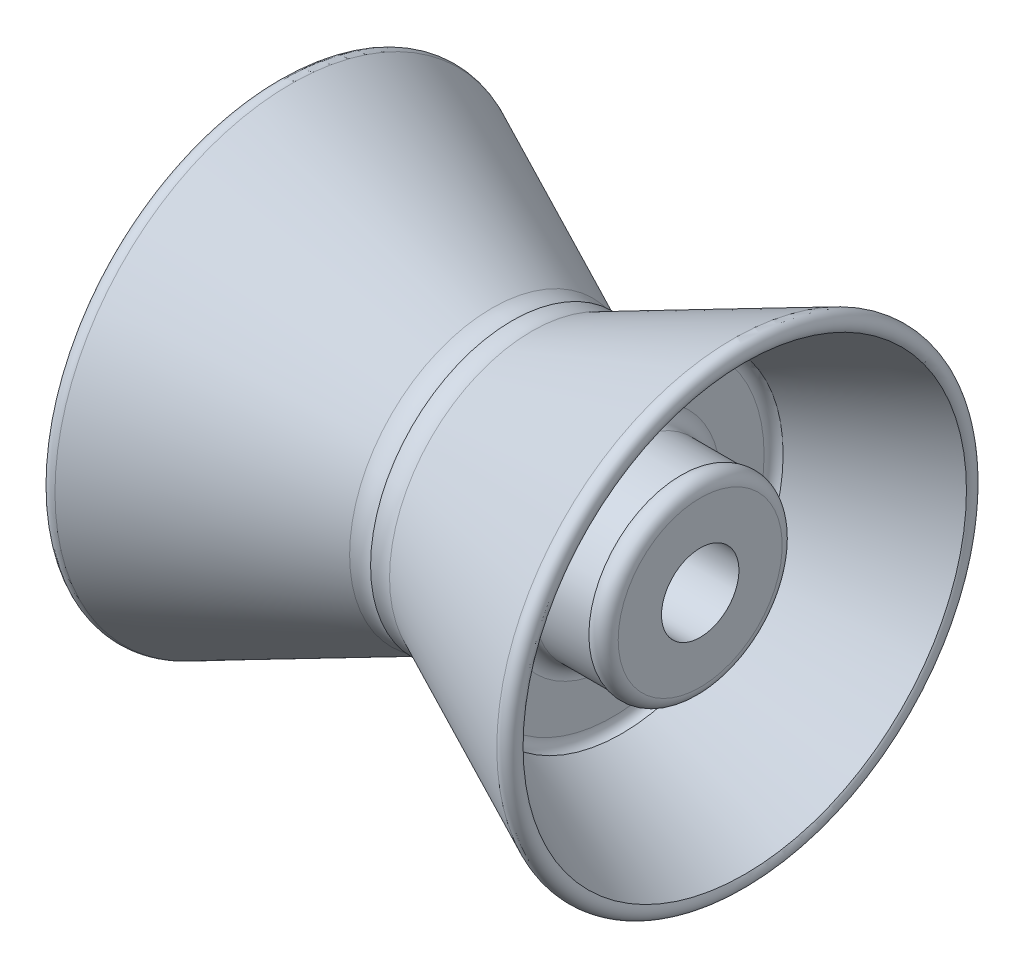
ISO-10303-21;
HEADER;
FILE_DESCRIPTION(('STEP AP214'),'2;1');
FILE_NAME('part.step','',(''),(''),'','','');
FILE_SCHEMA(('AUTOMOTIVE_DESIGN { 1 0 10303 214 1 1 1 1 }'));
ENDSEC;
DATA;
#1=APPLICATION_CONTEXT('core data for automotive mechanical design processes');
#2=APPLICATION_PROTOCOL_DEFINITION('international standard','automotive_design',2000,#1);
#3=PRODUCT_CONTEXT('',#1,'mechanical');
#4=PRODUCT('Part','Part','',(#3));
#5=PRODUCT_RELATED_PRODUCT_CATEGORY('part','',(#4));
#6=PRODUCT_DEFINITION_FORMATION('','',#4);
#7=PRODUCT_DEFINITION_CONTEXT('part definition',#1,'design');
#8=PRODUCT_DEFINITION('design','',#6,#7);
#9=PRODUCT_DEFINITION_SHAPE('','',#8);
#10=(LENGTH_UNIT() NAMED_UNIT(*) SI_UNIT(.MILLI.,.METRE.));
#11=(NAMED_UNIT(*) PLANE_ANGLE_UNIT() SI_UNIT($,.RADIAN.));
#12=(NAMED_UNIT(*) SI_UNIT($,.STERADIAN.) SOLID_ANGLE_UNIT());
#13=UNCERTAINTY_MEASURE_WITH_UNIT(LENGTH_MEASURE(1.E-05),#10,'distance_accuracy_value','');
#14=(GEOMETRIC_REPRESENTATION_CONTEXT(3) GLOBAL_UNCERTAINTY_ASSIGNED_CONTEXT((#13)) GLOBAL_UNIT_ASSIGNED_CONTEXT((#10,
#11,#12)) REPRESENTATION_CONTEXT('',''));
#15=CARTESIAN_POINT('',(0.,0.,0.));
#16=DIRECTION('',(0.,0.,1.));
#17=DIRECTION('',(1.,0.,0.));
#18=AXIS2_PLACEMENT_3D('',#15,#16,#17);
#19=CARTESIAN_POINT('',(89.9457941325228,0.,0.));
#20=DIRECTION('',(-1.,0.,0.));
#21=DIRECTION('',(0.,0.,1.));
#22=AXIS2_PLACEMENT_3D('',#19,#20,#21);
#23=PLANE('',#22);
#24=CARTESIAN_POINT('',(89.9457941325228,0.,0.));
#25=DIRECTION('',(-1.,0.,0.));
#26=DIRECTION('',(0.,0.,1.));
#27=AXIS2_PLACEMENT_3D('',#24,#25,#26);
#28=CIRCLE('',#27,39.1901164459736);
#29=CARTESIAN_POINT('',(89.9457941325228,0.,39.1901164459736));
#30=VERTEX_POINT('',#29);
#31=EDGE_CURVE('E10',#30,#30,#28,.T.);
#32=ORIENTED_EDGE('',*,*,#31,.F.);
#33=EDGE_LOOP('',(#32));
#34=FACE_BOUND('',#33,.T.);
#35=CARTESIAN_POINT('',(89.9457941325228,0.,0.));
#36=DIRECTION('',(-1.,0.,0.));
#37=DIRECTION('',(0.,0.,1.));
#38=AXIS2_PLACEMENT_3D('',#35,#36,#37);
#39=CIRCLE('',#38,18.495820800439);
#40=CARTESIAN_POINT('',(89.9457941325228,0.,18.495820800439));
#41=VERTEX_POINT('',#40);
#42=EDGE_CURVE('E164',#41,#41,#39,.T.);
#43=ORIENTED_EDGE('',*,*,#42,.T.);
#44=EDGE_LOOP('',(#43));
#45=FACE_BOUND('',#44,.T.);
#46=ADVANCED_FACE('F41',(#34,#45),#23,.F.);
#47=CARTESIAN_POINT('',(84.0599196998988,0.,0.));
#48=DIRECTION('',(-1.,0.,0.));
#49=DIRECTION('',(0.,0.,1.));
#50=AXIS2_PLACEMENT_3D('',#47,#48,#49);
#51=TOROIDAL_SURFACE('',#50,39.1901164459736,5.88587443262402);
#52=CARTESIAN_POINT('',(80.8781849582641,0.,0.));
#53=DIRECTION('',(-1.,0.,0.));
#54=DIRECTION('',(0.,0.,1.));
#55=AXIS2_PLACEMENT_3D('',#52,#53,#54);
#56=CIRCLE('',#55,44.1418920740178);
#57=CARTESIAN_POINT('',(80.8781849582641,0.,44.1418920740178));
#58=VERTEX_POINT('',#57);
#59=EDGE_CURVE('E48',#58,#58,#56,.T.);
#60=ORIENTED_EDGE('',*,*,#59,.F.);
#61=EDGE_LOOP('',(#60));
#62=FACE_BOUND('',#61,.T.);
#63=ORIENTED_EDGE('',*,*,#31,.T.);
#64=EDGE_LOOP('',(#63));
#65=FACE_BOUND('',#64,.T.);
#66=ADVANCED_FACE('F188',(#62,#65),#51,.T.);
#67=CARTESIAN_POINT('',(-137.85754493321,0.,0.));
#68=DIRECTION('',(-1.,0.,0.));
#69=DIRECTION('',(0.,0.,1.));
#70=AXIS2_PLACEMENT_3D('',#67,#68,#69);
#71=CYLINDRICAL_SURFACE('',#70,44.1418920740178);
#72=CARTESIAN_POINT('',(54.4687149420286,0.,0.));
#73=DIRECTION('',(-1.,0.,0.));
#74=DIRECTION('',(0.,0.,1.));
#75=AXIS2_PLACEMENT_3D('',#72,#73,#74);
#76=CIRCLE('',#75,44.1418920740178);
#77=CARTESIAN_POINT('',(54.4687149420286,0.,44.1418920740178));
#78=VERTEX_POINT('',#77);
#79=EDGE_CURVE('E53',#78,#78,#76,.T.);
#80=ORIENTED_EDGE('',*,*,#79,.F.);
#81=EDGE_LOOP('',(#80));
#82=FACE_BOUND('',#81,.T.);
#83=ORIENTED_EDGE('',*,*,#59,.T.);
#84=EDGE_LOOP('',(#83));
#85=FACE_BOUND('',#84,.T.);
#86=ADVANCED_FACE('F193',(#82,#85),#71,.T.);
#87=CARTESIAN_POINT('',(54.4687149420286,0.,0.));
#88=DIRECTION('',(-1.,0.,0.));
#89=DIRECTION('',(0.,0.,1.));
#90=AXIS2_PLACEMENT_3D('',#87,#88,#89);
#91=TOROIDAL_SURFACE('',#90,50.6095758659713,6.4676837919535);
#92=CARTESIAN_POINT('',(48.0726714224715,0.,0.));
#93=DIRECTION('',(-1.,0.,0.));
#94=DIRECTION('',(0.,0.,1.));
#95=AXIS2_PLACEMENT_3D('',#92,#93,#94);
#96=CIRCLE('',#95,51.569555516084);
#97=CARTESIAN_POINT('',(48.0726714224715,0.,51.569555516084));
#98=VERTEX_POINT('',#97);
#99=EDGE_CURVE('E58',#98,#98,#96,.T.);
#100=ORIENTED_EDGE('',*,*,#99,.F.);
#101=EDGE_LOOP('',(#100));
#102=FACE_BOUND('',#101,.T.);
#103=ORIENTED_EDGE('',*,*,#79,.T.);
#104=EDGE_LOOP('',(#103));
#105=FACE_BOUND('',#104,.T.);
#106=ADVANCED_FACE('F198',(#102,#105),#91,.F.);
#107=CARTESIAN_POINT('',(48.0726714224715,0.,0.));
#108=DIRECTION('',(-1.,0.,0.));
#109=DIRECTION('',(0.,0.,1.));
#110=AXIS2_PLACEMENT_3D('',#107,#108,#109);
#111=PLANE('',#110);
#112=CARTESIAN_POINT('',(48.0726714224715,0.,0.));
#113=DIRECTION('',(-1.,0.,0.));
#114=DIRECTION('',(0.,0.,1.));
#115=AXIS2_PLACEMENT_3D('',#112,#113,#114);
#116=CIRCLE('',#115,72.40827795077);
#117=CARTESIAN_POINT('',(48.0726714224715,0.,72.40827795077));
#118=VERTEX_POINT('',#117);
#119=EDGE_CURVE('E64',#118,#118,#116,.T.);
#120=ORIENTED_EDGE('',*,*,#119,.F.);
#121=EDGE_LOOP('',(#120));
#122=FACE_BOUND('',#121,.T.);
#123=ORIENTED_EDGE('',*,*,#99,.T.);
#124=EDGE_LOOP('',(#123));
#125=FACE_BOUND('',#124,.T.);
#126=ADVANCED_FACE('F204',(#122,#125),#111,.F.);
#127=CARTESIAN_POINT('',(52.8391522413573,0.,0.));
#128=DIRECTION('',(-1.,0.,0.));
#129=DIRECTION('',(0.,0.,1.));
#130=AXIS2_PLACEMENT_3D('',#127,#128,#129);
#131=TOROIDAL_SURFACE('',#130,72.40827795077,4.76648081888577);
#132=CARTESIAN_POINT('',(52.424586516698,0.,0.));
#133=DIRECTION('',(-1.,0.,0.));
#134=DIRECTION('',(0.,0.,1.));
#135=AXIS2_PLACEMENT_3D('',#132,#133,#134);
#136=CIRCLE('',#135,77.1566960722862);
#137=CARTESIAN_POINT('',(52.424586516698,0.,77.1566960722862));
#138=VERTEX_POINT('',#137);
#139=EDGE_CURVE('E68',#138,#138,#136,.T.);
#140=ORIENTED_EDGE('',*,*,#139,.F.);
#141=EDGE_LOOP('',(#140));
#142=FACE_BOUND('',#141,.T.);
#143=ORIENTED_EDGE('',*,*,#119,.T.);
#144=EDGE_LOOP('',(#143));
#145=FACE_BOUND('',#144,.T.);
#146=ADVANCED_FACE('F208',(#142,#145),#131,.F.);
#147=CARTESIAN_POINT('',(52.424586516698,0.,0.));
#148=DIRECTION('',(1.,0.,0.));
#149=DIRECTION('',(0.,0.,-1.));
#150=AXIS2_PLACEMENT_3D('',#147,#148,#149);
#151=CONICAL_SURFACE('',#150,77.1566960722862,0.455219161986922);
#152=CARTESIAN_POINT('',(111.246164538201,0.,0.));
#153=DIRECTION('',(-1.,0.,0.));
#154=DIRECTION('',(0.,0.,1.));
#155=AXIS2_PLACEMENT_3D('',#152,#153,#154);
#156=CIRCLE('',#155,105.95035301);
#157=CARTESIAN_POINT('',(111.246164538201,0.,105.95035301));
#158=VERTEX_POINT('',#157);
#159=EDGE_CURVE('E72',#158,#158,#156,.T.);
#160=ORIENTED_EDGE('',*,*,#159,.F.);
#161=EDGE_LOOP('',(#160));
#162=FACE_BOUND('',#161,.T.);
#163=ORIENTED_EDGE('',*,*,#139,.T.);
#164=EDGE_LOOP('',(#163));
#165=FACE_BOUND('',#164,.T.);
#166=ADVANCED_FACE('F212',(#162,#165),#151,.F.);
#167=CARTESIAN_POINT('',(107.525373797043,0.,0.));
#168=DIRECTION('',(-1.,0.,0.));
#169=DIRECTION('',(0.,0.,1.));
#170=AXIS2_PLACEMENT_3D('',#167,#168,#169);
#171=TOROIDAL_SURFACE('',#170,108.669777380016,4.60863891444369);
#172=ORIENTED_EDGE('',*,*,#159,.T.);
#173=EDGE_LOOP('',(#172));
#174=FACE_BOUND('',#173,.T.);
#175=CARTESIAN_POINT('',(105.57767883003,0.,0.));
#176=DIRECTION('',(-1.,0.,0.));
#177=DIRECTION('',(0.,0.,1.));
#178=AXIS2_PLACEMENT_3D('',#175,#176,#177);
#179=CIRCLE('',#178,112.846622715816);
#180=CARTESIAN_POINT('',(105.57767883003,0.,112.846622715816));
#181=VERTEX_POINT('',#180);
#182=EDGE_CURVE('E76',#181,#181,#179,.T.);
#183=ORIENTED_EDGE('',*,*,#182,.F.);
#184=EDGE_LOOP('',(#183));
#185=FACE_BOUND('',#184,.T.);
#186=ADVANCED_FACE('F216',(#174,#185),#171,.T.);
#187=CARTESIAN_POINT('',(105.57767883003,0.,0.));
#188=DIRECTION('',(1.,0.,0.));
#189=DIRECTION('',(0.,0.,-1.));
#190=AXIS2_PLACEMENT_3D('',#187,#188,#189);
#191=CONICAL_SURFACE('',#190,112.846622715816,0.43633231299858);
#192=CARTESIAN_POINT('',(9.54236568612607,0.,0.));
#193=DIRECTION('',(-1.,0.,0.));
#194=DIRECTION('',(0.,0.,1.));
#195=AXIS2_PLACEMENT_3D('',#192,#193,#194);
#196=CIRCLE('',#195,68.0646207435005);
#197=CARTESIAN_POINT('',(9.54236568612607,0.,68.0646207435005));
#198=VERTEX_POINT('',#197);
#199=EDGE_CURVE('E80',#198,#198,#196,.T.);
#200=ORIENTED_EDGE('',*,*,#199,.F.);
#201=EDGE_LOOP('',(#200));
#202=FACE_BOUND('',#201,.T.);
#203=ORIENTED_EDGE('',*,*,#182,.T.);
#204=EDGE_LOOP('',(#203));
#205=FACE_BOUND('',#204,.T.);
#206=ADVANCED_FACE('F220',(#202,#205),#191,.T.);
#207=CARTESIAN_POINT('',(4.18430612992772,0.,0.));
#208=DIRECTION('',(-1.,0.,0.));
#209=DIRECTION('',(0.,0.,1.));
#210=AXIS2_PLACEMENT_3D('',#207,#208,#209);
#211=TOROIDAL_SURFACE('',#210,79.5550165422703,12.678249004502);
#212=CARTESIAN_POINT('',(0.,0.,0.));
#213=DIRECTION('',(-1.,0.,0.));
#214=DIRECTION('',(0.,0.,1.));
#215=AXIS2_PLACEMENT_3D('',#212,#213,#214);
#216=CIRCLE('',#215,67.5871604255213);
#217=CARTESIAN_POINT('',(0.,0.,67.5871604255213));
#218=VERTEX_POINT('',#217);
#219=EDGE_CURVE('E84',#218,#218,#216,.T.);
#220=ORIENTED_EDGE('',*,*,#219,.F.);
#221=EDGE_LOOP('',(#220));
#222=FACE_BOUND('',#221,.T.);
#223=ORIENTED_EDGE('',*,*,#199,.T.);
#224=EDGE_LOOP('',(#223));
#225=FACE_BOUND('',#224,.T.);
#226=ADVANCED_FACE('F224',(#222,#225),#211,.F.);
#227=CARTESIAN_POINT('',(-4.18430612992771,0.,0.));
#228=DIRECTION('',(-1.,0.,0.));
#229=DIRECTION('',(0.,0.,1.));
#230=AXIS2_PLACEMENT_3D('',#227,#228,#229);
#231=TOROIDAL_SURFACE('',#230,79.5550165422703,12.678249004502);
#232=ORIENTED_EDGE('',*,*,#219,.T.);
#233=EDGE_LOOP('',(#232));
#234=FACE_BOUND('',#233,.T.);
#235=CARTESIAN_POINT('',(-9.54236568612607,0.,0.));
#236=DIRECTION('',(-1.,0.,0.));
#237=DIRECTION('',(0.,0.,1.));
#238=AXIS2_PLACEMENT_3D('',#235,#236,#237);
#239=CIRCLE('',#238,68.0646207435005);
#240=CARTESIAN_POINT('',(-9.54236568612607,0.,68.0646207435005));
#241=VERTEX_POINT('',#240);
#242=EDGE_CURVE('E88',#241,#241,#239,.T.);
#243=ORIENTED_EDGE('',*,*,#242,.F.);
#244=EDGE_LOOP('',(#243));
#245=FACE_BOUND('',#244,.T.);
#246=ADVANCED_FACE('F228',(#234,#245),#231,.F.);
#247=CARTESIAN_POINT('',(-105.57767883003,0.,0.));
#248=DIRECTION('',(-1.,0.,0.));
#249=DIRECTION('',(0.,0.,1.));
#250=AXIS2_PLACEMENT_3D('',#247,#248,#249);
#251=CONICAL_SURFACE('',#250,112.846622715816,0.43633231299858);
#252=ORIENTED_EDGE('',*,*,#242,.T.);
#253=EDGE_LOOP('',(#252));
#254=FACE_BOUND('',#253,.T.);
#255=CARTESIAN_POINT('',(-105.57767883003,0.,0.));
#256=DIRECTION('',(-1.,0.,0.));
#257=DIRECTION('',(0.,0.,1.));
#258=AXIS2_PLACEMENT_3D('',#255,#256,#257);
#259=CIRCLE('',#258,112.846622715816);
#260=CARTESIAN_POINT('',(-105.57767883003,0.,112.846622715816));
#261=VERTEX_POINT('',#260);
#262=EDGE_CURVE('E92',#261,#261,#259,.T.);
#263=ORIENTED_EDGE('',*,*,#262,.F.);
#264=EDGE_LOOP('',(#263));
#265=FACE_BOUND('',#264,.T.);
#266=ADVANCED_FACE('F232',(#254,#265),#251,.T.);
#267=CARTESIAN_POINT('',(-107.525373797043,0.,0.));
#268=DIRECTION('',(-1.,0.,0.));
#269=DIRECTION('',(0.,0.,1.));
#270=AXIS2_PLACEMENT_3D('',#267,#268,#269);
#271=TOROIDAL_SURFACE('',#270,108.669777380016,4.60863891444369);
#272=CARTESIAN_POINT('',(-111.246164538201,0.,0.));
#273=DIRECTION('',(-1.,0.,0.));
#274=DIRECTION('',(0.,0.,1.));
#275=AXIS2_PLACEMENT_3D('',#272,#273,#274);
#276=CIRCLE('',#275,105.950353009999);
#277=CARTESIAN_POINT('',(-111.246164538201,0.,105.950353009999));
#278=VERTEX_POINT('',#277);
#279=EDGE_CURVE('E96',#278,#278,#276,.T.);
#280=ORIENTED_EDGE('',*,*,#279,.F.);
#281=EDGE_LOOP('',(#280));
#282=FACE_BOUND('',#281,.T.);
#283=ORIENTED_EDGE('',*,*,#262,.T.);
#284=EDGE_LOOP('',(#283));
#285=FACE_BOUND('',#284,.T.);
#286=ADVANCED_FACE('F236',(#282,#285),#271,.T.);
#287=CARTESIAN_POINT('',(-52.424586516698,0.,0.));
#288=DIRECTION('',(-1.,0.,0.));
#289=DIRECTION('',(0.,0.,1.));
#290=AXIS2_PLACEMENT_3D('',#287,#288,#289);
#291=CONICAL_SURFACE('',#290,77.1566960722862,0.455219161986922);
#292=ORIENTED_EDGE('',*,*,#279,.T.);
#293=EDGE_LOOP('',(#292));
#294=FACE_BOUND('',#293,.T.);
#295=CARTESIAN_POINT('',(-52.424586516698,0.,0.));
#296=DIRECTION('',(-1.,0.,0.));
#297=DIRECTION('',(0.,0.,1.));
#298=AXIS2_PLACEMENT_3D('',#295,#296,#297);
#299=CIRCLE('',#298,77.1566960722862);
#300=CARTESIAN_POINT('',(-52.424586516698,0.,77.1566960722862));
#301=VERTEX_POINT('',#300);
#302=EDGE_CURVE('E100',#301,#301,#299,.T.);
#303=ORIENTED_EDGE('',*,*,#302,.F.);
#304=EDGE_LOOP('',(#303));
#305=FACE_BOUND('',#304,.T.);
#306=ADVANCED_FACE('F240',(#294,#305),#291,.F.);
#307=CARTESIAN_POINT('',(-52.8391522413573,0.,0.));
#308=DIRECTION('',(-1.,0.,0.));
#309=DIRECTION('',(0.,0.,1.));
#310=AXIS2_PLACEMENT_3D('',#307,#308,#309);
#311=TOROIDAL_SURFACE('',#310,72.40827795077,4.76648081888577);
#312=ORIENTED_EDGE('',*,*,#302,.T.);
#313=EDGE_LOOP('',(#312));
#314=FACE_BOUND('',#313,.T.);
#315=CARTESIAN_POINT('',(-48.0726714224715,0.,0.));
#316=DIRECTION('',(-1.,0.,0.));
#317=DIRECTION('',(0.,0.,1.));
#318=AXIS2_PLACEMENT_3D('',#315,#316,#317);
#319=CIRCLE('',#318,72.40827795077);
#320=CARTESIAN_POINT('',(-48.0726714224715,0.,72.40827795077));
#321=VERTEX_POINT('',#320);
#322=EDGE_CURVE('E104',#321,#321,#319,.T.);
#323=ORIENTED_EDGE('',*,*,#322,.F.);
#324=EDGE_LOOP('',(#323));
#325=FACE_BOUND('',#324,.T.);
#326=ADVANCED_FACE('F244',(#314,#325),#311,.F.);
#327=CARTESIAN_POINT('',(-48.0726714224715,0.,0.));
#328=DIRECTION('',(-1.,0.,0.));
#329=DIRECTION('',(0.,0.,1.));
#330=AXIS2_PLACEMENT_3D('',#327,#328,#329);
#331=PLANE('',#330);
#332=ORIENTED_EDGE('',*,*,#322,.T.);
#333=EDGE_LOOP('',(#332));
#334=FACE_BOUND('',#333,.T.);
#335=CARTESIAN_POINT('',(-48.0726714224715,0.,0.));
#336=DIRECTION('',(-1.,0.,0.));
#337=DIRECTION('',(0.,0.,1.));
#338=AXIS2_PLACEMENT_3D('',#335,#336,#337);
#339=CIRCLE('',#338,51.569555516084);
#340=CARTESIAN_POINT('',(-48.0726714224715,0.,51.569555516084));
#341=VERTEX_POINT('',#340);
#342=EDGE_CURVE('E108',#341,#341,#339,.T.);
#343=ORIENTED_EDGE('',*,*,#342,.F.);
#344=EDGE_LOOP('',(#343));
#345=FACE_BOUND('',#344,.T.);
#346=ADVANCED_FACE('F248',(#334,#345),#331,.T.);
#347=CARTESIAN_POINT('',(-54.4687149420285,0.,0.));
#348=DIRECTION('',(-1.,0.,0.));
#349=DIRECTION('',(0.,0.,1.));
#350=AXIS2_PLACEMENT_3D('',#347,#348,#349);
#351=TOROIDAL_SURFACE('',#350,50.6095758659713,6.4676837919535);
#352=ORIENTED_EDGE('',*,*,#342,.T.);
#353=EDGE_LOOP('',(#352));
#354=FACE_BOUND('',#353,.T.);
#355=CARTESIAN_POINT('',(-54.4687149420285,0.,0.));
#356=DIRECTION('',(-1.,0.,0.));
#357=DIRECTION('',(0.,0.,1.));
#358=AXIS2_PLACEMENT_3D('',#355,#356,#357);
#359=CIRCLE('',#358,44.1418920740178);
#360=CARTESIAN_POINT('',(-54.4687149420285,0.,44.1418920740178));
#361=VERTEX_POINT('',#360);
#362=EDGE_CURVE('E112',#361,#361,#359,.T.);
#363=ORIENTED_EDGE('',*,*,#362,.F.);
#364=EDGE_LOOP('',(#363));
#365=FACE_BOUND('',#364,.T.);
#366=ADVANCED_FACE('F252',(#354,#365),#351,.F.);
#367=CARTESIAN_POINT('',(-137.85754493321,0.,0.));
#368=DIRECTION('',(-1.,0.,0.));
#369=DIRECTION('',(0.,0.,1.));
#370=AXIS2_PLACEMENT_3D('',#367,#368,#369);
#371=CYLINDRICAL_SURFACE('',#370,44.1418920740178);
#372=ORIENTED_EDGE('',*,*,#362,.T.);
#373=EDGE_LOOP('',(#372));
#374=FACE_BOUND('',#373,.T.);
#375=CARTESIAN_POINT('',(-80.8781849582641,0.,0.));
#376=DIRECTION('',(-1.,0.,0.));
#377=DIRECTION('',(0.,0.,1.));
#378=AXIS2_PLACEMENT_3D('',#375,#376,#377);
#379=CIRCLE('',#378,44.1418920740178);
#380=CARTESIAN_POINT('',(-80.8781849582641,0.,44.1418920740178));
#381=VERTEX_POINT('',#380);
#382=EDGE_CURVE('E116',#381,#381,#379,.T.);
#383=ORIENTED_EDGE('',*,*,#382,.F.);
#384=EDGE_LOOP('',(#383));
#385=FACE_BOUND('',#384,.T.);
#386=ADVANCED_FACE('F256',(#374,#385),#371,.T.);
#387=CARTESIAN_POINT('',(-84.0599196998987,0.,0.));
#388=DIRECTION('',(-1.,0.,0.));
#389=DIRECTION('',(0.,0.,1.));
#390=AXIS2_PLACEMENT_3D('',#387,#388,#389);
#391=TOROIDAL_SURFACE('',#390,39.1901164459736,5.88587443262402);
#392=ORIENTED_EDGE('',*,*,#382,.T.);
#393=EDGE_LOOP('',(#392));
#394=FACE_BOUND('',#393,.T.);
#395=CARTESIAN_POINT('',(-89.9457941325228,0.,0.));
#396=DIRECTION('',(-1.,0.,0.));
#397=DIRECTION('',(0.,0.,1.));
#398=AXIS2_PLACEMENT_3D('',#395,#396,#397);
#399=CIRCLE('',#398,39.1901164459736);
#400=CARTESIAN_POINT('',(-89.9457941325228,0.,39.1901164459736));
#401=VERTEX_POINT('',#400);
#402=EDGE_CURVE('E120',#401,#401,#399,.T.);
#403=ORIENTED_EDGE('',*,*,#402,.F.);
#404=EDGE_LOOP('',(#403));
#405=FACE_BOUND('',#404,.T.);
#406=ADVANCED_FACE('F260',(#394,#405),#391,.T.);
#407=CARTESIAN_POINT('',(-89.9457941325228,0.,0.));
#408=DIRECTION('',(-1.,0.,0.));
#409=DIRECTION('',(0.,0.,1.));
#410=AXIS2_PLACEMENT_3D('',#407,#408,#409);
#411=PLANE('',#410);
#412=ORIENTED_EDGE('',*,*,#402,.T.);
#413=EDGE_LOOP('',(#412));
#414=FACE_BOUND('',#413,.T.);
#415=CARTESIAN_POINT('',(-89.9457941325228,0.,0.));
#416=DIRECTION('',(-1.,0.,0.));
#417=DIRECTION('',(0.,0.,1.));
#418=AXIS2_PLACEMENT_3D('',#415,#416,#417);
#419=CIRCLE('',#418,18.495820800439);
#420=CARTESIAN_POINT('',(-89.9457941325228,0.,18.495820800439));
#421=VERTEX_POINT('',#420);
#422=EDGE_CURVE('E124',#421,#421,#419,.T.);
#423=ORIENTED_EDGE('',*,*,#422,.F.);
#424=EDGE_LOOP('',(#423));
#425=FACE_BOUND('',#424,.T.);
#426=ADVANCED_FACE('F264',(#414,#425),#411,.T.);
#427=CARTESIAN_POINT('',(-137.85754493321,0.,0.));
#428=DIRECTION('',(-1.,0.,0.));
#429=DIRECTION('',(0.,0.,1.));
#430=AXIS2_PLACEMENT_3D('',#427,#428,#429);
#431=CYLINDRICAL_SURFACE('',#430,18.495820800439);
#432=ORIENTED_EDGE('',*,*,#422,.T.);
#433=EDGE_LOOP('',(#432));
#434=FACE_BOUND('',#433,.T.);
#435=CARTESIAN_POINT('',(-39.2433659737723,0.,0.));
#436=DIRECTION('',(-1.,0.,0.));
#437=DIRECTION('',(0.,0.,1.));
#438=AXIS2_PLACEMENT_3D('',#435,#436,#437);
#439=CIRCLE('',#438,18.495820800439);
#440=CARTESIAN_POINT('',(-39.2433659737723,0.,18.495820800439));
#441=VERTEX_POINT('',#440);
#442=EDGE_CURVE('E128',#441,#441,#439,.T.);
#443=ORIENTED_EDGE('',*,*,#442,.F.);
#444=EDGE_LOOP('',(#443));
#445=FACE_BOUND('',#444,.T.);
#446=ADVANCED_FACE('F268',(#434,#445),#431,.F.);
#447=CARTESIAN_POINT('',(-39.2433659737723,0.,0.));
#448=DIRECTION('',(-1.,0.,0.));
#449=DIRECTION('',(0.,0.,1.));
#450=AXIS2_PLACEMENT_3D('',#447,#448,#449);
#451=PLANE('',#450);
#452=CARTESIAN_POINT('',(-39.2433659737723,0.,0.));
#453=DIRECTION('',(-1.,0.,0.));
#454=DIRECTION('',(0.,0.,1.));
#455=AXIS2_PLACEMENT_3D('',#452,#453,#454);
#456=CIRCLE('',#455,50.6412339341406);
#457=CARTESIAN_POINT('',(-39.2433659737723,0.,50.6412339341406));
#458=VERTEX_POINT('',#457);
#459=EDGE_CURVE('E132',#458,#458,#456,.T.);
#460=ORIENTED_EDGE('',*,*,#459,.F.);
#461=EDGE_LOOP('',(#460));
#462=FACE_BOUND('',#461,.T.);
#463=ORIENTED_EDGE('',*,*,#442,.T.);
#464=EDGE_LOOP('',(#463));
#465=FACE_BOUND('',#464,.T.);
#466=ADVANCED_FACE('F272',(#462,#465),#451,.F.);
#467=CARTESIAN_POINT('',(-33.0536464387171,0.,0.));
#468=DIRECTION('',(-1.,0.,0.));
#469=DIRECTION('',(0.,0.,1.));
#470=AXIS2_PLACEMENT_3D('',#467,#468,#469);
#471=TOROIDAL_SURFACE('',#470,50.6412339341406,6.1897195350552);
#472=CARTESIAN_POINT('',(-31.9228739581635,0.,0.));
#473=DIRECTION('',(-1.,0.,0.));
#474=DIRECTION('',(0.,0.,1.));
#475=AXIS2_PLACEMENT_3D('',#472,#473,#474);
#476=CIRCLE('',#475,56.7267890871128);
#477=CARTESIAN_POINT('',(-31.9228739581635,0.,56.7267890871128));
#478=VERTEX_POINT('',#477);
#479=EDGE_CURVE('E136',#478,#478,#476,.T.);
#480=ORIENTED_EDGE('',*,*,#479,.F.);
#481=EDGE_LOOP('',(#480));
#482=FACE_BOUND('',#481,.T.);
#483=ORIENTED_EDGE('',*,*,#459,.T.);
#484=EDGE_LOOP('',(#483));
#485=FACE_BOUND('',#484,.T.);
#486=ADVANCED_FACE('F276',(#482,#485),#471,.F.);
#487=CARTESIAN_POINT('',(-31.9228739581635,0.,0.));
#488=DIRECTION('',(-1.,0.,0.));
#489=DIRECTION('',(0.,0.,1.));
#490=AXIS2_PLACEMENT_3D('',#487,#488,#489);
#491=CONICAL_SURFACE('',#490,56.7267890871128,0.43633231299858);
#492=CARTESIAN_POINT('',(-7.6445441958958,0.,0.));
#493=DIRECTION('',(-1.,0.,0.));
#494=DIRECTION('',(0.,0.,1.));
#495=AXIS2_PLACEMENT_3D('',#492,#493,#494);
#496=CIRCLE('',#495,45.4056179917551);
#497=CARTESIAN_POINT('',(-7.6445441958958,0.,45.4056179917551));
#498=VERTEX_POINT('',#497);
#499=EDGE_CURVE('E140',#498,#498,#496,.T.);
#500=ORIENTED_EDGE('',*,*,#499,.F.);
#501=EDGE_LOOP('',(#500));
#502=FACE_BOUND('',#501,.T.);
#503=ORIENTED_EDGE('',*,*,#479,.T.);
#504=EDGE_LOOP('',(#503));
#505=FACE_BOUND('',#504,.T.);
#506=ADVANCED_FACE('F280',(#502,#505),#491,.F.);
#507=CARTESIAN_POINT('',(-4.1843061299277,0.,0.));
#508=DIRECTION('',(-1.,0.,0.));
#509=DIRECTION('',(0.,0.,1.));
#510=AXIS2_PLACEMENT_3D('',#507,#508,#509);
#511=TOROIDAL_SURFACE('',#510,52.8261224708343,8.1876207897783);
#512=CARTESIAN_POINT('',(0.,0.,0.));
#513=DIRECTION('',(-1.,0.,0.));
#514=DIRECTION('',(0.,0.,1.));
#515=AXIS2_PLACEMENT_3D('',#512,#513,#514);
#516=CIRCLE('',#515,45.7884583407227);
#517=CARTESIAN_POINT('',(0.,0.,45.7884583407227));
#518=VERTEX_POINT('',#517);
#519=EDGE_CURVE('E144',#518,#518,#516,.T.);
#520=ORIENTED_EDGE('',*,*,#519,.F.);
#521=EDGE_LOOP('',(#520));
#522=FACE_BOUND('',#521,.T.);
#523=ORIENTED_EDGE('',*,*,#499,.T.);
#524=EDGE_LOOP('',(#523));
#525=FACE_BOUND('',#524,.T.);
#526=ADVANCED_FACE('F284',(#522,#525),#511,.T.);
#527=CARTESIAN_POINT('',(4.18430612992771,0.,0.));
#528=DIRECTION('',(-1.,0.,0.));
#529=DIRECTION('',(0.,0.,1.));
#530=AXIS2_PLACEMENT_3D('',#527,#528,#529);
#531=TOROIDAL_SURFACE('',#530,52.8261224708343,8.1876207897783);
#532=ORIENTED_EDGE('',*,*,#519,.T.);
#533=EDGE_LOOP('',(#532));
#534=FACE_BOUND('',#533,.T.);
#535=CARTESIAN_POINT('',(7.6445441958958,0.,0.));
#536=DIRECTION('',(-1.,0.,0.));
#537=DIRECTION('',(0.,0.,1.));
#538=AXIS2_PLACEMENT_3D('',#535,#536,#537);
#539=CIRCLE('',#538,45.4056179917551);
#540=CARTESIAN_POINT('',(7.6445441958958,0.,45.4056179917551));
#541=VERTEX_POINT('',#540);
#542=EDGE_CURVE('E148',#541,#541,#539,.T.);
#543=ORIENTED_EDGE('',*,*,#542,.F.);
#544=EDGE_LOOP('',(#543));
#545=FACE_BOUND('',#544,.T.);
#546=ADVANCED_FACE('F288',(#534,#545),#531,.T.);
#547=CARTESIAN_POINT('',(31.9228739581635,0.,0.));
#548=DIRECTION('',(1.,0.,0.));
#549=DIRECTION('',(0.,0.,-1.));
#550=AXIS2_PLACEMENT_3D('',#547,#548,#549);
#551=CONICAL_SURFACE('',#550,56.7267890871128,0.43633231299858);
#552=ORIENTED_EDGE('',*,*,#542,.T.);
#553=EDGE_LOOP('',(#552));
#554=FACE_BOUND('',#553,.T.);
#555=CARTESIAN_POINT('',(31.9228739581635,0.,0.));
#556=DIRECTION('',(-1.,0.,0.));
#557=DIRECTION('',(0.,0.,1.));
#558=AXIS2_PLACEMENT_3D('',#555,#556,#557);
#559=CIRCLE('',#558,56.7267890871128);
#560=CARTESIAN_POINT('',(31.9228739581635,0.,56.7267890871128));
#561=VERTEX_POINT('',#560);
#562=EDGE_CURVE('E152',#561,#561,#559,.T.);
#563=ORIENTED_EDGE('',*,*,#562,.F.);
#564=EDGE_LOOP('',(#563));
#565=FACE_BOUND('',#564,.T.);
#566=ADVANCED_FACE('F184',(#554,#565),#551,.F.);
#567=CARTESIAN_POINT('',(33.0536464387171,0.,0.));
#568=DIRECTION('',(-1.,0.,0.));
#569=DIRECTION('',(0.,0.,1.));
#570=AXIS2_PLACEMENT_3D('',#567,#568,#569);
#571=TOROIDAL_SURFACE('',#570,50.6412339341406,6.1897195350552);
#572=ORIENTED_EDGE('',*,*,#562,.T.);
#573=EDGE_LOOP('',(#572));
#574=FACE_BOUND('',#573,.T.);
#575=CARTESIAN_POINT('',(39.2433659737723,0.,0.));
#576=DIRECTION('',(-1.,0.,0.));
#577=DIRECTION('',(0.,0.,1.));
#578=AXIS2_PLACEMENT_3D('',#575,#576,#577);
#579=CIRCLE('',#578,50.6412339341406);
#580=CARTESIAN_POINT('',(39.2433659737723,0.,50.6412339341406));
#581=VERTEX_POINT('',#580);
#582=EDGE_CURVE('E156',#581,#581,#579,.T.);
#583=ORIENTED_EDGE('',*,*,#582,.F.);
#584=EDGE_LOOP('',(#583));
#585=FACE_BOUND('',#584,.T.);
#586=ADVANCED_FACE('F178',(#574,#585),#571,.F.);
#587=CARTESIAN_POINT('',(39.2433659737723,0.,0.));
#588=DIRECTION('',(-1.,0.,0.));
#589=DIRECTION('',(0.,0.,1.));
#590=AXIS2_PLACEMENT_3D('',#587,#588,#589);
#591=PLANE('',#590);
#592=ORIENTED_EDGE('',*,*,#582,.T.);
#593=EDGE_LOOP('',(#592));
#594=FACE_BOUND('',#593,.T.);
#595=CARTESIAN_POINT('',(39.2433659737723,0.,0.));
#596=DIRECTION('',(-1.,0.,0.));
#597=DIRECTION('',(0.,0.,1.));
#598=AXIS2_PLACEMENT_3D('',#595,#596,#597);
#599=CIRCLE('',#598,18.495820800439);
#600=CARTESIAN_POINT('',(39.2433659737723,0.,18.495820800439));
#601=VERTEX_POINT('',#600);
#602=EDGE_CURVE('E160',#601,#601,#599,.T.);
#603=ORIENTED_EDGE('',*,*,#602,.F.);
#604=EDGE_LOOP('',(#603));
#605=FACE_BOUND('',#604,.T.);
#606=ADVANCED_FACE('F173',(#594,#605),#591,.T.);
#607=CARTESIAN_POINT('',(-137.85754493321,0.,0.));
#608=DIRECTION('',(-1.,0.,0.));
#609=DIRECTION('',(0.,0.,1.));
#610=AXIS2_PLACEMENT_3D('',#607,#608,#609);
#611=CYLINDRICAL_SURFACE('',#610,18.495820800439);
#612=ORIENTED_EDGE('',*,*,#42,.F.);
#613=EDGE_LOOP('',(#612));
#614=FACE_BOUND('',#613,.T.);
#615=ORIENTED_EDGE('',*,*,#602,.T.);
#616=EDGE_LOOP('',(#615));
#617=FACE_BOUND('',#616,.T.);
#618=ADVANCED_FACE('F170',(#614,#617),#611,.F.);
#619=CLOSED_SHELL('',(#46,#66,#86,#106,#126,#146,#166,#186,#206,#226,#246,#266,#286,#306,#326,
#346,#366,#386,#406,#426,#446,#466,#486,#506,#526,#546,#566,#586,#606,#618));
#620=MANIFOLD_SOLID_BREP('B2',#619);
#621=ADVANCED_BREP_SHAPE_REPRESENTATION('',(#18,#620),#14);
#622=SHAPE_DEFINITION_REPRESENTATION(#9,#621);
ENDSEC;
END-ISO-10303-21;
